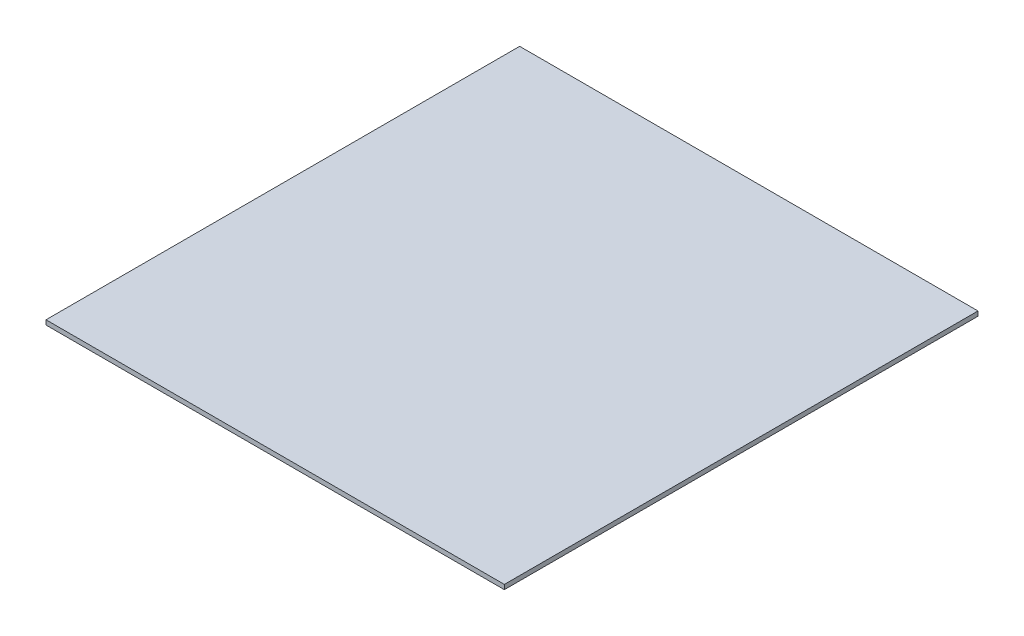
ISO-10303-21;
HEADER;
FILE_DESCRIPTION(('STEP AP214'),'2;1');
FILE_NAME('part.step','',(''),(''),'','','');
FILE_SCHEMA(('AUTOMOTIVE_DESIGN { 1 0 10303 214 1 1 1 1 }'));
ENDSEC;
DATA;
#1=APPLICATION_CONTEXT('core data for automotive mechanical design processes');
#2=APPLICATION_PROTOCOL_DEFINITION('international standard','automotive_design',2000,#1);
#3=PRODUCT_CONTEXT('',#1,'mechanical');
#4=PRODUCT('Part','Part','',(#3));
#5=PRODUCT_RELATED_PRODUCT_CATEGORY('part','',(#4));
#6=PRODUCT_DEFINITION_FORMATION('','',#4);
#7=PRODUCT_DEFINITION_CONTEXT('part definition',#1,'design');
#8=PRODUCT_DEFINITION('design','',#6,#7);
#9=PRODUCT_DEFINITION_SHAPE('','',#8);
#10=(LENGTH_UNIT() NAMED_UNIT(*) SI_UNIT(.MILLI.,.METRE.));
#11=(NAMED_UNIT(*) PLANE_ANGLE_UNIT() SI_UNIT($,.RADIAN.));
#12=(NAMED_UNIT(*) SI_UNIT($,.STERADIAN.) SOLID_ANGLE_UNIT());
#13=UNCERTAINTY_MEASURE_WITH_UNIT(LENGTH_MEASURE(1.E-05),#10,'distance_accuracy_value','');
#14=(GEOMETRIC_REPRESENTATION_CONTEXT(3) GLOBAL_UNCERTAINTY_ASSIGNED_CONTEXT((#13)) GLOBAL_UNIT_ASSIGNED_CONTEXT((#10,
#11,#12)) REPRESENTATION_CONTEXT('',''));
#15=CARTESIAN_POINT('',(0.,0.,0.));
#16=DIRECTION('',(0.,0.,1.));
#17=DIRECTION('',(1.,0.,0.));
#18=AXIS2_PLACEMENT_3D('',#15,#16,#17);
#19=CARTESIAN_POINT('',(150.,3.,-155.));
#20=DIRECTION('',(-1.,0.,0.));
#21=DIRECTION('',(0.,0.,1.));
#22=AXIS2_PLACEMENT_3D('',#19,#20,#21);
#23=PLANE('',#22);
#24=DIRECTION('',(0.,0.,-1.));
#25=VECTOR('',#24,1.);
#26=CARTESIAN_POINT('',(150.,0.,-155.));
#27=LINE('',#26,#25);
#28=CARTESIAN_POINT('',(150.,0.,155.));
#29=VERTEX_POINT('',#28);
#30=CARTESIAN_POINT('',(150.,0.,-155.));
#31=VERTEX_POINT('',#30);
#32=EDGE_CURVE('E96',#29,#31,#27,.T.);
#33=ORIENTED_EDGE('',*,*,#32,.T.);
#34=DIRECTION('',(0.,-1.,0.));
#35=VECTOR('',#34,1.);
#36=CARTESIAN_POINT('',(150.,3.,-155.));
#37=LINE('',#36,#35);
#38=CARTESIAN_POINT('',(150.,3.,-155.));
#39=VERTEX_POINT('',#38);
#40=EDGE_CURVE('E11',#39,#31,#37,.T.);
#41=ORIENTED_EDGE('',*,*,#40,.F.);
#42=DIRECTION('',(0.,0.,-1.));
#43=VECTOR('',#42,1.);
#44=CARTESIAN_POINT('',(150.,3.,-155.));
#45=LINE('',#44,#43);
#46=CARTESIAN_POINT('',(150.,3.,155.));
#47=VERTEX_POINT('',#46);
#48=EDGE_CURVE('E84',#47,#39,#45,.T.);
#49=ORIENTED_EDGE('',*,*,#48,.F.);
#50=DIRECTION('',(0.,-1.,0.));
#51=VECTOR('',#50,1.);
#52=CARTESIAN_POINT('',(150.,3.,155.));
#53=LINE('',#52,#51);
#54=EDGE_CURVE('E92',#47,#29,#53,.T.);
#55=ORIENTED_EDGE('',*,*,#54,.T.);
#56=EDGE_LOOP('',(#33,#41,#49,#55));
#57=FACE_BOUND('',#56,.T.);
#58=ADVANCED_FACE('F33',(#57),#23,.F.);
#59=CARTESIAN_POINT('',(-150.,3.,-155.));
#60=DIRECTION('',(0.,0.,1.));
#61=DIRECTION('',(1.,0.,0.));
#62=AXIS2_PLACEMENT_3D('',#59,#60,#61);
#63=PLANE('',#62);
#64=DIRECTION('',(-1.,0.,0.));
#65=VECTOR('',#64,1.);
#66=CARTESIAN_POINT('',(-150.,0.,-155.));
#67=LINE('',#66,#65);
#68=CARTESIAN_POINT('',(-150.,0.,-155.));
#69=VERTEX_POINT('',#68);
#70=EDGE_CURVE('E88',#31,#69,#67,.T.);
#71=ORIENTED_EDGE('',*,*,#70,.T.);
#72=DIRECTION('',(0.,-1.,0.));
#73=VECTOR('',#72,1.);
#74=CARTESIAN_POINT('',(-150.,3.,-155.));
#75=LINE('',#74,#73);
#76=CARTESIAN_POINT('',(-150.,3.,-155.));
#77=VERTEX_POINT('',#76);
#78=EDGE_CURVE('E41',#77,#69,#75,.T.);
#79=ORIENTED_EDGE('',*,*,#78,.F.);
#80=DIRECTION('',(-1.,0.,0.));
#81=VECTOR('',#80,1.);
#82=CARTESIAN_POINT('',(-150.,3.,-155.));
#83=LINE('',#82,#81);
#84=EDGE_CURVE('E79',#39,#77,#83,.T.);
#85=ORIENTED_EDGE('',*,*,#84,.F.);
#86=ORIENTED_EDGE('',*,*,#40,.T.);
#87=EDGE_LOOP('',(#71,#79,#85,#86));
#88=FACE_BOUND('',#87,.T.);
#89=ADVANCED_FACE('F87',(#88),#63,.F.);
#90=CARTESIAN_POINT('',(-150.,3.,-155.));
#91=DIRECTION('',(1.,0.,0.));
#92=DIRECTION('',(0.,0.,-1.));
#93=AXIS2_PLACEMENT_3D('',#90,#91,#92);
#94=PLANE('',#93);
#95=DIRECTION('',(0.,0.,1.));
#96=VECTOR('',#95,1.);
#97=CARTESIAN_POINT('',(-150.,0.,-155.));
#98=LINE('',#97,#96);
#99=CARTESIAN_POINT('',(-150.,0.,155.));
#100=VERTEX_POINT('',#99);
#101=EDGE_CURVE('E66',#69,#100,#98,.T.);
#102=ORIENTED_EDGE('',*,*,#101,.T.);
#103=DIRECTION('',(0.,-1.,0.));
#104=VECTOR('',#103,1.);
#105=CARTESIAN_POINT('',(-150.,3.,155.));
#106=LINE('',#105,#104);
#107=CARTESIAN_POINT('',(-150.,3.,155.));
#108=VERTEX_POINT('',#107);
#109=EDGE_CURVE('E89',#108,#100,#106,.T.);
#110=ORIENTED_EDGE('',*,*,#109,.F.);
#111=DIRECTION('',(0.,0.,1.));
#112=VECTOR('',#111,1.);
#113=CARTESIAN_POINT('',(-150.,3.,-155.));
#114=LINE('',#113,#112);
#115=EDGE_CURVE('E82',#77,#108,#114,.T.);
#116=ORIENTED_EDGE('',*,*,#115,.F.);
#117=ORIENTED_EDGE('',*,*,#78,.T.);
#118=EDGE_LOOP('',(#102,#110,#116,#117));
#119=FACE_BOUND('',#118,.T.);
#120=ADVANCED_FACE('F90',(#119),#94,.F.);
#121=CARTESIAN_POINT('',(-150.,3.,155.));
#122=DIRECTION('',(0.,0.,-1.));
#123=DIRECTION('',(-1.,0.,0.));
#124=AXIS2_PLACEMENT_3D('',#121,#122,#123);
#125=PLANE('',#124);
#126=DIRECTION('',(1.,0.,0.));
#127=VECTOR('',#126,1.);
#128=CARTESIAN_POINT('',(-150.,0.,155.));
#129=LINE('',#128,#127);
#130=EDGE_CURVE('E72',#100,#29,#129,.T.);
#131=ORIENTED_EDGE('',*,*,#130,.T.);
#132=ORIENTED_EDGE('',*,*,#54,.F.);
#133=DIRECTION('',(1.,0.,0.));
#134=VECTOR('',#133,1.);
#135=CARTESIAN_POINT('',(-150.,3.,155.));
#136=LINE('',#135,#134);
#137=EDGE_CURVE('E49',#108,#47,#136,.T.);
#138=ORIENTED_EDGE('',*,*,#137,.F.);
#139=ORIENTED_EDGE('',*,*,#109,.T.);
#140=EDGE_LOOP('',(#131,#132,#138,#139));
#141=FACE_BOUND('',#140,.T.);
#142=ADVANCED_FACE('F103',(#141),#125,.F.);
#143=CARTESIAN_POINT('',(0.,3.,0.));
#144=DIRECTION('',(0.,1.,0.));
#145=DIRECTION('',(0.,0.,1.));
#146=AXIS2_PLACEMENT_3D('',#143,#144,#145);
#147=PLANE('',#146);
#148=ORIENTED_EDGE('',*,*,#48,.T.);
#149=ORIENTED_EDGE('',*,*,#84,.T.);
#150=ORIENTED_EDGE('',*,*,#115,.T.);
#151=ORIENTED_EDGE('',*,*,#137,.T.);
#152=EDGE_LOOP('',(#148,#149,#150,#151));
#153=FACE_BOUND('',#152,.T.);
#154=ADVANCED_FACE('F80',(#153),#147,.T.);
#155=CARTESIAN_POINT('',(0.,0.,0.));
#156=DIRECTION('',(0.,1.,0.));
#157=DIRECTION('',(0.,0.,1.));
#158=AXIS2_PLACEMENT_3D('',#155,#156,#157);
#159=PLANE('',#158);
#160=ORIENTED_EDGE('',*,*,#32,.F.);
#161=ORIENTED_EDGE('',*,*,#130,.F.);
#162=ORIENTED_EDGE('',*,*,#101,.F.);
#163=ORIENTED_EDGE('',*,*,#70,.F.);
#164=EDGE_LOOP('',(#160,#161,#162,#163));
#165=FACE_BOUND('',#164,.T.);
#166=ADVANCED_FACE('F106',(#165),#159,.F.);
#167=CLOSED_SHELL('',(#58,#89,#120,#142,#154,#166));
#168=MANIFOLD_SOLID_BREP('B2',#167);
#169=ADVANCED_BREP_SHAPE_REPRESENTATION('',(#18,#168),#14);
#170=SHAPE_DEFINITION_REPRESENTATION(#9,#169);
ENDSEC;
END-ISO-10303-21;
